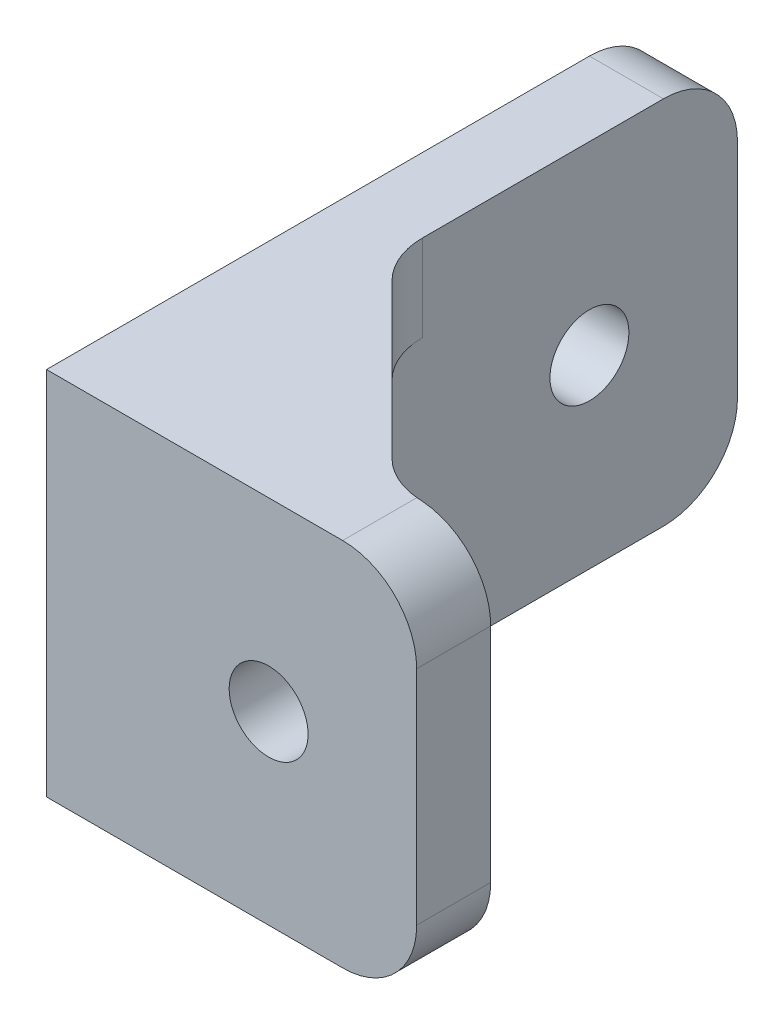
ISO-10303-21;
HEADER;
FILE_DESCRIPTION(('STEP AP214'),'2;1');
FILE_NAME('part.step','',(''),(''),'','','');
FILE_SCHEMA(('AUTOMOTIVE_DESIGN { 1 0 10303 214 1 1 1 1 }'));
ENDSEC;
DATA;
#1=APPLICATION_CONTEXT('core data for automotive mechanical design processes');
#2=APPLICATION_PROTOCOL_DEFINITION('international standard','automotive_design',2000,#1);
#3=PRODUCT_CONTEXT('',#1,'mechanical');
#4=PRODUCT('Part','Part','',(#3));
#5=PRODUCT_RELATED_PRODUCT_CATEGORY('part','',(#4));
#6=PRODUCT_DEFINITION_FORMATION('','',#4);
#7=PRODUCT_DEFINITION_CONTEXT('part definition',#1,'design');
#8=PRODUCT_DEFINITION('design','',#6,#7);
#9=PRODUCT_DEFINITION_SHAPE('','',#8);
#10=(LENGTH_UNIT() NAMED_UNIT(*) SI_UNIT(.MILLI.,.METRE.));
#11=(NAMED_UNIT(*) PLANE_ANGLE_UNIT() SI_UNIT($,.RADIAN.));
#12=(NAMED_UNIT(*) SI_UNIT($,.STERADIAN.) SOLID_ANGLE_UNIT());
#13=UNCERTAINTY_MEASURE_WITH_UNIT(LENGTH_MEASURE(1.E-05),#10,'distance_accuracy_value','');
#14=(GEOMETRIC_REPRESENTATION_CONTEXT(3) GLOBAL_UNCERTAINTY_ASSIGNED_CONTEXT((#13)) GLOBAL_UNIT_ASSIGNED_CONTEXT((#10,
#11,#12)) REPRESENTATION_CONTEXT('',''));
#15=CARTESIAN_POINT('',(0.,0.,0.));
#16=DIRECTION('',(0.,0.,1.));
#17=DIRECTION('',(1.,0.,0.));
#18=AXIS2_PLACEMENT_3D('',#15,#16,#17);
#19=CARTESIAN_POINT('',(3.,15.,-11.));
#20=DIRECTION('',(-0.707106781186551,0.,0.707106781186544));
#21=DIRECTION('',(0.,-1.,0.));
#22=AXIS2_PLACEMENT_3D('',#19,#20,#21);
#23=PLANE('',#22);
#24=DIRECTION('',(0.707106781186544,0.,0.707106781186551));
#25=VECTOR('',#24,1.);
#26=CARTESIAN_POINT('',(3.,3.5,-11.));
#27=LINE('',#26,#25);
#28=CARTESIAN_POINT('',(3.87867965644035,3.5,-10.1213203435597));
#29=VERTEX_POINT('',#28);
#30=CARTESIAN_POINT('',(10.1213203435596,3.5,-3.87867965644037));
#31=VERTEX_POINT('',#30);
#32=EDGE_CURVE('E283',#29,#31,#27,.T.);
#33=ORIENTED_EDGE('',*,*,#32,.T.);
#34=DIRECTION('',(0.,1.,0.));
#35=VECTOR('',#34,1.);
#36=CARTESIAN_POINT('',(10.1213203435596,15.,-3.87867965644037));
#37=LINE('',#36,#35);
#38=CARTESIAN_POINT('',(10.1213203435596,0.,-3.87867965644037));
#39=VERTEX_POINT('',#38);
#40=EDGE_CURVE('E319',#31,#39,#37,.F.);
#41=ORIENTED_EDGE('',*,*,#40,.T.);
#42=DIRECTION('',(0.707106781186544,0.,0.707106781186551));
#43=VECTOR('',#42,1.);
#44=CARTESIAN_POINT('',(7.00000000000004,0.,-6.99999999999997));
#45=LINE('',#44,#43);
#46=CARTESIAN_POINT('',(3.87867965644035,0.,-10.1213203435597));
#47=VERTEX_POINT('',#46);
#48=EDGE_CURVE('E271',#47,#39,#45,.T.);
#49=ORIENTED_EDGE('',*,*,#48,.F.);
#50=DIRECTION('',(0.,-1.,0.));
#51=VECTOR('',#50,1.);
#52=CARTESIAN_POINT('',(3.87867965644035,3.5,-10.1213203435597));
#53=LINE('',#52,#51);
#54=EDGE_CURVE('E316',#47,#29,#53,.F.);
#55=ORIENTED_EDGE('',*,*,#54,.T.);
#56=EDGE_LOOP('',(#33,#41,#49,#55));
#57=FACE_BOUND('',#56,.T.);
#58=ADVANCED_FACE('F45',(#57),#23,.F.);
#59=CARTESIAN_POINT('',(0.,15.,0.));
#60=DIRECTION('',(0.,0.,-1.));
#61=DIRECTION('',(-1.,0.,0.));
#62=AXIS2_PLACEMENT_3D('',#59,#60,#61);
#63=PLANE('',#62);
#64=CARTESIAN_POINT('',(9.,7.5,0.));
#65=DIRECTION('',(0.,0.,-1.));
#66=DIRECTION('',(-1.,0.,0.));
#67=AXIS2_PLACEMENT_3D('',#64,#65,#66);
#68=CIRCLE('',#67,1.6);
#69=CARTESIAN_POINT('',(7.4,7.5,0.));
#70=VERTEX_POINT('',#69);
#71=EDGE_CURVE('E212',#70,#70,#68,.T.);
#72=ORIENTED_EDGE('',*,*,#71,.T.);
#73=EDGE_LOOP('',(#72));
#74=FACE_BOUND('',#73,.T.);
#75=DIRECTION('',(1.,0.,0.));
#76=VECTOR('',#75,1.);
#77=CARTESIAN_POINT('',(0.,15.,0.));
#78=LINE('',#77,#76);
#79=CARTESIAN_POINT('',(0.,15.,0.));
#80=VERTEX_POINT('',#79);
#81=CARTESIAN_POINT('',(12.,15.,0.));
#82=VERTEX_POINT('',#81);
#83=EDGE_CURVE('E190',#80,#82,#78,.T.);
#84=ORIENTED_EDGE('',*,*,#83,.F.);
#85=DIRECTION('',(0.,-1.,0.));
#86=VECTOR('',#85,1.);
#87=CARTESIAN_POINT('',(0.,15.,0.));
#88=LINE('',#87,#86);
#89=CARTESIAN_POINT('',(0.,0.,0.));
#90=VERTEX_POINT('',#89);
#91=EDGE_CURVE('E175',#80,#90,#88,.T.);
#92=ORIENTED_EDGE('',*,*,#91,.T.);
#93=DIRECTION('',(1.,0.,0.));
#94=VECTOR('',#93,1.);
#95=CARTESIAN_POINT('',(0.,0.,0.));
#96=LINE('',#95,#94);
#97=CARTESIAN_POINT('',(12.,0.,0.));
#98=VERTEX_POINT('',#97);
#99=EDGE_CURVE('E209',#90,#98,#96,.T.);
#100=ORIENTED_EDGE('',*,*,#99,.T.);
#101=CARTESIAN_POINT('',(12.,3.,0.));
#102=DIRECTION('',(0.,0.,-1.));
#103=DIRECTION('',(-1.,0.,0.));
#104=AXIS2_PLACEMENT_3D('',#101,#102,#103);
#105=CIRCLE('',#104,3.);
#106=CARTESIAN_POINT('',(15.,3.,0.));
#107=VERTEX_POINT('',#106);
#108=EDGE_CURVE('E266',#98,#107,#105,.F.);
#109=ORIENTED_EDGE('',*,*,#108,.T.);
#110=DIRECTION('',(0.,-1.,0.));
#111=VECTOR('',#110,1.);
#112=CARTESIAN_POINT('',(15.,15.,0.));
#113=LINE('',#112,#111);
#114=CARTESIAN_POINT('',(15.,12.,0.));
#115=VERTEX_POINT('',#114);
#116=EDGE_CURVE('E223',#115,#107,#113,.T.);
#117=ORIENTED_EDGE('',*,*,#116,.F.);
#118=CARTESIAN_POINT('',(12.,12.,0.));
#119=DIRECTION('',(0.,0.,-1.));
#120=DIRECTION('',(-1.,0.,0.));
#121=AXIS2_PLACEMENT_3D('',#118,#119,#120);
#122=CIRCLE('',#121,3.);
#123=EDGE_CURVE('E199',#115,#82,#122,.F.);
#124=ORIENTED_EDGE('',*,*,#123,.T.);
#125=EDGE_LOOP('',(#84,#92,#100,#109,#117,#124));
#126=FACE_BOUND('',#125,.T.);
#127=ADVANCED_FACE('F196',(#74,#126),#63,.F.);
#128=CARTESIAN_POINT('',(15.,15.,0.));
#129=DIRECTION('',(-1.,0.,0.));
#130=DIRECTION('',(0.,0.,1.));
#131=AXIS2_PLACEMENT_3D('',#128,#129,#130);
#132=PLANE('',#131);
#133=DIRECTION('',(0.,-1.,0.));
#134=VECTOR('',#133,1.);
#135=CARTESIAN_POINT('',(15.,15.,-3.));
#136=LINE('',#135,#134);
#137=CARTESIAN_POINT('',(15.,12.,-3.));
#138=VERTEX_POINT('',#137);
#139=CARTESIAN_POINT('',(15.,3.,-3.));
#140=VERTEX_POINT('',#139);
#141=EDGE_CURVE('E220',#138,#140,#136,.T.);
#142=ORIENTED_EDGE('',*,*,#141,.F.);
#143=DIRECTION('',(0.,0.,-1.));
#144=VECTOR('',#143,1.);
#145=CARTESIAN_POINT('',(15.,12.,0.));
#146=LINE('',#145,#144);
#147=EDGE_CURVE('E263',#138,#115,#146,.F.);
#148=ORIENTED_EDGE('',*,*,#147,.T.);
#149=ORIENTED_EDGE('',*,*,#116,.T.);
#150=DIRECTION('',(0.,0.,-1.));
#151=VECTOR('',#150,1.);
#152=CARTESIAN_POINT('',(15.,3.,0.));
#153=LINE('',#152,#151);
#154=EDGE_CURVE('E259',#107,#140,#153,.T.);
#155=ORIENTED_EDGE('',*,*,#154,.T.);
#156=EDGE_LOOP('',(#142,#148,#149,#155));
#157=FACE_BOUND('',#156,.T.);
#158=ADVANCED_FACE('F384',(#157),#132,.F.);
#159=CARTESIAN_POINT('',(0.,15.,-3.));
#160=DIRECTION('',(0.,0.,-1.));
#161=DIRECTION('',(-1.,0.,0.));
#162=AXIS2_PLACEMENT_3D('',#159,#160,#161);
#163=PLANE('',#162);
#164=DIRECTION('',(1.,0.,0.));
#165=VECTOR('',#164,1.);
#166=CARTESIAN_POINT('',(-8.31370849898479,3.5,-3.));
#167=LINE('',#166,#165);
#168=CARTESIAN_POINT('',(6.,3.5,-3.));
#169=VERTEX_POINT('',#168);
#170=CARTESIAN_POINT('',(12.2426406871193,3.5,-3.));
#171=VERTEX_POINT('',#170);
#172=EDGE_CURVE('E445',#169,#171,#167,.T.);
#173=ORIENTED_EDGE('',*,*,#172,.F.);
#174=DIRECTION('',(0.,-1.,0.));
#175=VECTOR('',#174,1.);
#176=CARTESIAN_POINT('',(6.,15.,-3.));
#177=LINE('',#176,#175);
#178=CARTESIAN_POINT('',(6.,11.5,-3.));
#179=VERTEX_POINT('',#178);
#180=EDGE_CURVE('E310',#169,#179,#177,.F.);
#181=ORIENTED_EDGE('',*,*,#180,.T.);
#182=DIRECTION('',(1.,0.,0.));
#183=VECTOR('',#182,1.);
#184=CARTESIAN_POINT('',(-8.31370849898479,11.5,-3.));
#185=LINE('',#184,#183);
#186=CARTESIAN_POINT('',(12.2426406871193,11.5,-3.));
#187=VERTEX_POINT('',#186);
#188=EDGE_CURVE('E430',#179,#187,#185,.T.);
#189=ORIENTED_EDGE('',*,*,#188,.T.);
#190=DIRECTION('',(0.,1.,0.));
#191=VECTOR('',#190,1.);
#192=CARTESIAN_POINT('',(12.2426406871193,15.,-3.));
#193=LINE('',#192,#191);
#194=CARTESIAN_POINT('',(12.2426406871193,14.9901714828675,-3.));
#195=VERTEX_POINT('',#194);
#196=EDGE_CURVE('E302',#187,#195,#193,.T.);
#197=ORIENTED_EDGE('',*,*,#196,.T.);
#198=CARTESIAN_POINT('',(12.,12.,-3.));
#199=DIRECTION('',(0.,0.,-1.));
#200=DIRECTION('',(-1.,0.,0.));
#201=AXIS2_PLACEMENT_3D('',#198,#199,#200);
#202=CIRCLE('',#201,3.);
#203=EDGE_CURVE('E256',#195,#138,#202,.T.);
#204=ORIENTED_EDGE('',*,*,#203,.T.);
#205=ORIENTED_EDGE('',*,*,#141,.T.);
#206=CARTESIAN_POINT('',(12.,3.,-3.));
#207=DIRECTION('',(0.,0.,-1.));
#208=DIRECTION('',(-1.,0.,0.));
#209=AXIS2_PLACEMENT_3D('',#206,#207,#208);
#210=CIRCLE('',#209,3.);
#211=CARTESIAN_POINT('',(12.2426406871193,0.00982851713245353,-3.));
#212=VERTEX_POINT('',#211);
#213=EDGE_CURVE('E252',#140,#212,#210,.T.);
#214=ORIENTED_EDGE('',*,*,#213,.T.);
#215=DIRECTION('',(0.,1.,0.));
#216=VECTOR('',#215,1.);
#217=CARTESIAN_POINT('',(12.2426406871193,15.,-3.));
#218=LINE('',#217,#216);
#219=EDGE_CURVE('E306',#212,#171,#218,.T.);
#220=ORIENTED_EDGE('',*,*,#219,.T.);
#221=EDGE_LOOP('',(#173,#181,#189,#197,#204,#205,#214,#220));
#222=FACE_BOUND('',#221,.T.);
#223=CARTESIAN_POINT('',(9.,7.5,-3.));
#224=DIRECTION('',(0.,0.,1.));
#225=DIRECTION('',(0.,-1.,0.));
#226=AXIS2_PLACEMENT_3D('',#223,#224,#225);
#227=CIRCLE('',#226,1.6);
#228=CARTESIAN_POINT('',(9.,5.9,-3.));
#229=VERTEX_POINT('',#228);
#230=EDGE_CURVE('E448',#229,#229,#227,.F.);
#231=ORIENTED_EDGE('',*,*,#230,.F.);
#232=EDGE_LOOP('',(#231));
#233=FACE_BOUND('',#232,.T.);
#234=ADVANCED_FACE('F437',(#222,#233),#163,.T.);
#235=CARTESIAN_POINT('',(3.,15.,0.));
#236=DIRECTION('',(-1.,0.,0.));
#237=DIRECTION('',(0.,0.,1.));
#238=AXIS2_PLACEMENT_3D('',#235,#236,#237);
#239=PLANE('',#238);
#240=CARTESIAN_POINT('',(3.,7.5,-19.));
#241=DIRECTION('',(1.,0.,0.));
#242=DIRECTION('',(0.,0.,-1.));
#243=AXIS2_PLACEMENT_3D('',#240,#241,#242);
#244=CIRCLE('',#243,1.6);
#245=CARTESIAN_POINT('',(3.,7.5,-20.6));
#246=VERTEX_POINT('',#245);
#247=EDGE_CURVE('E475',#246,#246,#244,.T.);
#248=ORIENTED_EDGE('',*,*,#247,.F.);
#249=EDGE_LOOP('',(#248));
#250=FACE_BOUND('',#249,.T.);
#251=DIRECTION('',(0.,0.,1.));
#252=VECTOR('',#251,1.);
#253=CARTESIAN_POINT('',(3.,11.5,-3.));
#254=LINE('',#253,#252);
#255=CARTESIAN_POINT('',(3.,11.5,-12.2426406871193));
#256=VERTEX_POINT('',#255);
#257=CARTESIAN_POINT('',(3.,11.5,-6.));
#258=VERTEX_POINT('',#257);
#259=EDGE_CURVE('E452',#256,#258,#254,.T.);
#260=ORIENTED_EDGE('',*,*,#259,.T.);
#261=DIRECTION('',(0.,-1.,0.));
#262=VECTOR('',#261,1.);
#263=CARTESIAN_POINT('',(3.,15.,-6.));
#264=LINE('',#263,#262);
#265=CARTESIAN_POINT('',(3.,3.5,-6.));
#266=VERTEX_POINT('',#265);
#267=EDGE_CURVE('E295',#258,#266,#264,.T.);
#268=ORIENTED_EDGE('',*,*,#267,.T.);
#269=DIRECTION('',(0.,0.,-1.));
#270=VECTOR('',#269,1.);
#271=CARTESIAN_POINT('',(3.,3.5,-3.));
#272=LINE('',#271,#270);
#273=CARTESIAN_POINT('',(3.,3.5,-12.2426406871193));
#274=VERTEX_POINT('',#273);
#275=EDGE_CURVE('E460',#266,#274,#272,.T.);
#276=ORIENTED_EDGE('',*,*,#275,.T.);
#277=DIRECTION('',(0.,-1.,0.));
#278=VECTOR('',#277,1.);
#279=CARTESIAN_POINT('',(3.,0.,-12.2426406871193));
#280=LINE('',#279,#278);
#281=CARTESIAN_POINT('',(3.,0.,-12.2426406871193));
#282=VERTEX_POINT('',#281);
#283=EDGE_CURVE('E291',#274,#282,#280,.T.);
#284=ORIENTED_EDGE('',*,*,#283,.T.);
#285=DIRECTION('',(0.,0.,-1.));
#286=VECTOR('',#285,1.);
#287=CARTESIAN_POINT('',(3.,0.,0.));
#288=LINE('',#287,#286);
#289=CARTESIAN_POINT('',(3.,0.,-22.));
#290=VERTEX_POINT('',#289);
#291=EDGE_CURVE('E202',#282,#290,#288,.T.);
#292=ORIENTED_EDGE('',*,*,#291,.T.);
#293=CARTESIAN_POINT('',(3.,3.,-22.));
#294=DIRECTION('',(-1.,0.,0.));
#295=DIRECTION('',(0.,0.,1.));
#296=AXIS2_PLACEMENT_3D('',#293,#294,#295);
#297=CIRCLE('',#296,3.);
#298=CARTESIAN_POINT('',(3.,3.,-25.));
#299=VERTEX_POINT('',#298);
#300=EDGE_CURVE('E234',#290,#299,#297,.F.);
#301=ORIENTED_EDGE('',*,*,#300,.T.);
#302=DIRECTION('',(0.,-1.,0.));
#303=VECTOR('',#302,1.);
#304=CARTESIAN_POINT('',(3.,15.,-25.));
#305=LINE('',#304,#303);
#306=CARTESIAN_POINT('',(3.,12.,-25.));
#307=VERTEX_POINT('',#306);
#308=EDGE_CURVE('E206',#307,#299,#305,.T.);
#309=ORIENTED_EDGE('',*,*,#308,.F.);
#310=CARTESIAN_POINT('',(3.,12.,-22.));
#311=DIRECTION('',(-1.,0.,0.));
#312=DIRECTION('',(0.,0.,1.));
#313=AXIS2_PLACEMENT_3D('',#310,#311,#312);
#314=CIRCLE('',#313,3.);
#315=CARTESIAN_POINT('',(3.,15.,-22.));
#316=VERTEX_POINT('',#315);
#317=EDGE_CURVE('E237',#307,#316,#314,.F.);
#318=ORIENTED_EDGE('',*,*,#317,.T.);
#319=DIRECTION('',(0.,0.,-1.));
#320=VECTOR('',#319,1.);
#321=CARTESIAN_POINT('',(3.,15.,0.));
#322=LINE('',#321,#320);
#323=CARTESIAN_POINT('',(3.,15.,-12.2426406871193));
#324=VERTEX_POINT('',#323);
#325=EDGE_CURVE('E201',#324,#316,#322,.T.);
#326=ORIENTED_EDGE('',*,*,#325,.F.);
#327=DIRECTION('',(0.,-1.,0.));
#328=VECTOR('',#327,1.);
#329=CARTESIAN_POINT('',(3.,11.5,-12.2426406871193));
#330=LINE('',#329,#328);
#331=EDGE_CURVE('E287',#324,#256,#330,.T.);
#332=ORIENTED_EDGE('',*,*,#331,.T.);
#333=EDGE_LOOP('',(#260,#268,#276,#284,#292,#301,#309,#318,#326,#332));
#334=FACE_BOUND('',#333,.T.);
#335=CARTESIAN_POINT('',(3.,7.5,-9.));
#336=DIRECTION('',(-1.,0.,0.));
#337=DIRECTION('',(0.,0.,1.));
#338=AXIS2_PLACEMENT_3D('',#335,#336,#337);
#339=CIRCLE('',#338,1.6);
#340=CARTESIAN_POINT('',(3.,7.5,-7.4));
#341=VERTEX_POINT('',#340);
#342=EDGE_CURVE('E472',#341,#341,#339,.F.);
#343=ORIENTED_EDGE('',*,*,#342,.F.);
#344=EDGE_LOOP('',(#343));
#345=FACE_BOUND('',#344,.T.);
#346=ADVANCED_FACE('F455',(#250,#334,#345),#239,.F.);
#347=CARTESIAN_POINT('',(0.,15.,-25.));
#348=DIRECTION('',(0.,0.,-1.));
#349=DIRECTION('',(-1.,0.,0.));
#350=AXIS2_PLACEMENT_3D('',#347,#348,#349);
#351=PLANE('',#350);
#352=DIRECTION('',(0.,-1.,0.));
#353=VECTOR('',#352,1.);
#354=CARTESIAN_POINT('',(0.,15.,-25.));
#355=LINE('',#354,#353);
#356=CARTESIAN_POINT('',(0.,12.,-25.));
#357=VERTEX_POINT('',#356);
#358=CARTESIAN_POINT('',(0.,3.,-25.));
#359=VERTEX_POINT('',#358);
#360=EDGE_CURVE('E61',#357,#359,#355,.T.);
#361=ORIENTED_EDGE('',*,*,#360,.F.);
#362=DIRECTION('',(1.,0.,0.));
#363=VECTOR('',#362,1.);
#364=CARTESIAN_POINT('',(0.,12.,-25.));
#365=LINE('',#364,#363);
#366=EDGE_CURVE('E231',#357,#307,#365,.T.);
#367=ORIENTED_EDGE('',*,*,#366,.T.);
#368=ORIENTED_EDGE('',*,*,#308,.T.);
#369=DIRECTION('',(1.,0.,0.));
#370=VECTOR('',#369,1.);
#371=CARTESIAN_POINT('',(0.,3.,-25.));
#372=LINE('',#371,#370);
#373=EDGE_CURVE('E227',#299,#359,#372,.F.);
#374=ORIENTED_EDGE('',*,*,#373,.T.);
#375=EDGE_LOOP('',(#361,#367,#368,#374));
#376=FACE_BOUND('',#375,.T.);
#377=ADVANCED_FACE('F500',(#376),#351,.T.);
#378=CARTESIAN_POINT('',(0.,15.,0.));
#379=DIRECTION('',(0.,1.,0.));
#380=DIRECTION('',(0.,0.,1.));
#381=AXIS2_PLACEMENT_3D('',#378,#379,#380);
#382=PLANE('',#381);
#383=DIRECTION('',(0.,0.,1.));
#384=VECTOR('',#383,1.);
#385=CARTESIAN_POINT('',(0.,15.,0.));
#386=LINE('',#385,#384);
#387=CARTESIAN_POINT('',(0.,15.,-22.));
#388=VERTEX_POINT('',#387);
#389=EDGE_CURVE('E179',#388,#80,#386,.T.);
#390=ORIENTED_EDGE('',*,*,#389,.T.);
#391=ORIENTED_EDGE('',*,*,#83,.T.);
#392=DIRECTION('',(0.,0.,-1.));
#393=VECTOR('',#392,1.);
#394=CARTESIAN_POINT('',(12.,15.,-3.));
#395=LINE('',#394,#393);
#396=CARTESIAN_POINT('',(12.,15.,-3.00982851713245));
#397=VERTEX_POINT('',#396);
#398=EDGE_CURVE('E69',#82,#397,#395,.T.);
#399=ORIENTED_EDGE('',*,*,#398,.T.);
#400=CARTESIAN_POINT('',(12.2426406871193,15.,-6.));
#401=DIRECTION('',(0.,1.,0.));
#402=DIRECTION('',(0.,0.,1.));
#403=AXIS2_PLACEMENT_3D('',#400,#401,#402);
#404=CIRCLE('',#403,3.);
#405=CARTESIAN_POINT('',(10.1213203435596,15.,-3.87867965644037));
#406=VERTEX_POINT('',#405);
#407=EDGE_CURVE('E422',#397,#406,#404,.F.);
#408=ORIENTED_EDGE('',*,*,#407,.T.);
#409=DIRECTION('',(-0.707106781186544,0.,-0.707106781186551));
#410=VECTOR('',#409,1.);
#411=CARTESIAN_POINT('',(3.,15.,-11.));
#412=LINE('',#411,#410);
#413=CARTESIAN_POINT('',(3.87867965644035,15.,-10.1213203435597));
#414=VERTEX_POINT('',#413);
#415=EDGE_CURVE('E275',#406,#414,#412,.T.);
#416=ORIENTED_EDGE('',*,*,#415,.T.);
#417=CARTESIAN_POINT('',(6.,15.,-12.2426406871193));
#418=DIRECTION('',(0.,1.,0.));
#419=DIRECTION('',(0.,0.,1.));
#420=AXIS2_PLACEMENT_3D('',#417,#418,#419);
#421=CIRCLE('',#420,3.);
#422=EDGE_CURVE('E410',#414,#324,#421,.F.);
#423=ORIENTED_EDGE('',*,*,#422,.T.);
#424=ORIENTED_EDGE('',*,*,#325,.T.);
#425=DIRECTION('',(1.,0.,0.));
#426=VECTOR('',#425,1.);
#427=CARTESIAN_POINT('',(0.,15.,-22.));
#428=LINE('',#427,#426);
#429=EDGE_CURVE('E193',#316,#388,#428,.F.);
#430=ORIENTED_EDGE('',*,*,#429,.T.);
#431=EDGE_LOOP('',(#390,#391,#399,#408,#416,#423,#424,#430));
#432=FACE_BOUND('',#431,.T.);
#433=ADVANCED_FACE('F189',(#432),#382,.T.);
#434=CARTESIAN_POINT('',(0.,0.,0.));
#435=DIRECTION('',(0.,1.,0.));
#436=DIRECTION('',(0.,0.,1.));
#437=AXIS2_PLACEMENT_3D('',#434,#435,#436);
#438=PLANE('',#437);
#439=ORIENTED_EDGE('',*,*,#99,.F.);
#440=DIRECTION('',(0.,0.,1.));
#441=VECTOR('',#440,1.);
#442=CARTESIAN_POINT('',(0.,0.,0.));
#443=LINE('',#442,#441);
#444=CARTESIAN_POINT('',(0.,0.,-22.));
#445=VERTEX_POINT('',#444);
#446=EDGE_CURVE('E182',#445,#90,#443,.T.);
#447=ORIENTED_EDGE('',*,*,#446,.F.);
#448=DIRECTION('',(1.,0.,0.));
#449=VECTOR('',#448,1.);
#450=CARTESIAN_POINT('',(3.,0.,-22.));
#451=LINE('',#450,#449);
#452=EDGE_CURVE('E249',#445,#290,#451,.T.);
#453=ORIENTED_EDGE('',*,*,#452,.T.);
#454=ORIENTED_EDGE('',*,*,#291,.F.);
#455=CARTESIAN_POINT('',(6.,0.,-12.2426406871193));
#456=DIRECTION('',(0.,1.,0.));
#457=DIRECTION('',(0.,0.,1.));
#458=AXIS2_PLACEMENT_3D('',#455,#456,#457);
#459=CIRCLE('',#458,3.);
#460=EDGE_CURVE('E344',#282,#47,#459,.T.);
#461=ORIENTED_EDGE('',*,*,#460,.T.);
#462=ORIENTED_EDGE('',*,*,#48,.T.);
#463=CARTESIAN_POINT('',(12.2426406871193,0.,-6.));
#464=DIRECTION('',(0.,1.,0.));
#465=DIRECTION('',(0.,0.,1.));
#466=AXIS2_PLACEMENT_3D('',#463,#464,#465);
#467=CIRCLE('',#466,3.);
#468=CARTESIAN_POINT('',(12.,0.,-3.00982851713245));
#469=VERTEX_POINT('',#468);
#470=EDGE_CURVE('E331',#39,#469,#467,.T.);
#471=ORIENTED_EDGE('',*,*,#470,.T.);
#472=DIRECTION('',(0.,0.,-1.));
#473=VECTOR('',#472,1.);
#474=CARTESIAN_POINT('',(12.,0.,0.));
#475=LINE('',#474,#473);
#476=EDGE_CURVE('E245',#469,#98,#475,.F.);
#477=ORIENTED_EDGE('',*,*,#476,.T.);
#478=EDGE_LOOP('',(#439,#447,#453,#454,#461,#462,#471,#477));
#479=FACE_BOUND('',#478,.T.);
#480=ADVANCED_FACE('F399',(#479),#438,.F.);
#481=CARTESIAN_POINT('',(9.,7.5,0.));
#482=DIRECTION('',(0.,0.,-1.));
#483=DIRECTION('',(-1.,0.,0.));
#484=AXIS2_PLACEMENT_3D('',#481,#482,#483);
#485=CYLINDRICAL_SURFACE('',#484,1.6);
#486=ORIENTED_EDGE('',*,*,#230,.T.);
#487=EDGE_LOOP('',(#486));
#488=FACE_BOUND('',#487,.T.);
#489=ORIENTED_EDGE('',*,*,#71,.F.);
#490=EDGE_LOOP('',(#489));
#491=FACE_BOUND('',#490,.T.);
#492=ADVANCED_FACE('F484',(#488,#491),#485,.F.);
#493=CARTESIAN_POINT('',(0.,7.5,-19.));
#494=DIRECTION('',(1.,0.,0.));
#495=DIRECTION('',(0.,0.,-1.));
#496=AXIS2_PLACEMENT_3D('',#493,#494,#495);
#497=CYLINDRICAL_SURFACE('',#496,1.6);
#498=CARTESIAN_POINT('',(0.,7.5,-19.));
#499=DIRECTION('',(1.,0.,0.));
#500=DIRECTION('',(0.,0.,-1.));
#501=AXIS2_PLACEMENT_3D('',#498,#499,#500);
#502=CIRCLE('',#501,1.6);
#503=CARTESIAN_POINT('',(0.,7.5,-20.6));
#504=VERTEX_POINT('',#503);
#505=EDGE_CURVE('E465',#504,#504,#502,.F.);
#506=ORIENTED_EDGE('',*,*,#505,.T.);
#507=EDGE_LOOP('',(#506));
#508=FACE_BOUND('',#507,.T.);
#509=ORIENTED_EDGE('',*,*,#247,.T.);
#510=EDGE_LOOP('',(#509));
#511=FACE_BOUND('',#510,.T.);
#512=ADVANCED_FACE('F486',(#508,#511),#497,.F.);
#513=CARTESIAN_POINT('',(0.,7.5,-9.));
#514=DIRECTION('',(1.,0.,0.));
#515=DIRECTION('',(0.,0.,-1.));
#516=AXIS2_PLACEMENT_3D('',#513,#514,#515);
#517=CYLINDRICAL_SURFACE('',#516,1.6);
#518=CARTESIAN_POINT('',(0.,7.5,-9.));
#519=DIRECTION('',(1.,0.,0.));
#520=DIRECTION('',(0.,0.,-1.));
#521=AXIS2_PLACEMENT_3D('',#518,#519,#520);
#522=CIRCLE('',#521,1.6);
#523=CARTESIAN_POINT('',(0.,7.5,-10.6));
#524=VERTEX_POINT('',#523);
#525=EDGE_CURVE('E535',#524,#524,#522,.F.);
#526=ORIENTED_EDGE('',*,*,#525,.T.);
#527=EDGE_LOOP('',(#526));
#528=FACE_BOUND('',#527,.T.);
#529=ORIENTED_EDGE('',*,*,#342,.T.);
#530=EDGE_LOOP('',(#529));
#531=FACE_BOUND('',#530,.T.);
#532=ADVANCED_FACE('F493',(#528,#531),#517,.F.);
#533=CARTESIAN_POINT('',(0.,12.,-22.));
#534=DIRECTION('',(1.,0.,0.));
#535=DIRECTION('',(0.,0.,-1.));
#536=AXIS2_PLACEMENT_3D('',#533,#534,#535);
#537=CYLINDRICAL_SURFACE('',#536,3.);
#538=CARTESIAN_POINT('',(0.,12.,-22.));
#539=DIRECTION('',(1.,0.,0.));
#540=DIRECTION('',(0.,0.,-1.));
#541=AXIS2_PLACEMENT_3D('',#538,#539,#540);
#542=CIRCLE('',#541,3.);
#543=EDGE_CURVE('E531',#388,#357,#542,.F.);
#544=ORIENTED_EDGE('',*,*,#543,.F.);
#545=ORIENTED_EDGE('',*,*,#429,.F.);
#546=ORIENTED_EDGE('',*,*,#317,.F.);
#547=ORIENTED_EDGE('',*,*,#366,.F.);
#548=EDGE_LOOP('',(#544,#545,#546,#547));
#549=FACE_BOUND('',#548,.T.);
#550=ADVANCED_FACE('F512',(#549),#537,.T.);
#551=CARTESIAN_POINT('',(0.,3.,-22.));
#552=DIRECTION('',(-1.,0.,0.));
#553=DIRECTION('',(0.,0.,1.));
#554=AXIS2_PLACEMENT_3D('',#551,#552,#553);
#555=CYLINDRICAL_SURFACE('',#554,3.);
#556=CARTESIAN_POINT('',(0.,3.,-22.));
#557=DIRECTION('',(1.,0.,0.));
#558=DIRECTION('',(0.,0.,-1.));
#559=AXIS2_PLACEMENT_3D('',#556,#557,#558);
#560=CIRCLE('',#559,3.);
#561=EDGE_CURVE('E11',#359,#445,#560,.F.);
#562=ORIENTED_EDGE('',*,*,#561,.F.);
#563=ORIENTED_EDGE('',*,*,#373,.F.);
#564=ORIENTED_EDGE('',*,*,#300,.F.);
#565=ORIENTED_EDGE('',*,*,#452,.F.);
#566=EDGE_LOOP('',(#562,#563,#564,#565));
#567=FACE_BOUND('',#566,.T.);
#568=ADVANCED_FACE('F514',(#567),#555,.T.);
#569=CARTESIAN_POINT('',(12.,12.,0.));
#570=DIRECTION('',(0.,0.,1.));
#571=DIRECTION('',(1.,0.,0.));
#572=AXIS2_PLACEMENT_3D('',#569,#570,#571);
#573=CYLINDRICAL_SURFACE('',#572,3.);
#574=ORIENTED_EDGE('',*,*,#123,.F.);
#575=ORIENTED_EDGE('',*,*,#147,.F.);
#576=ORIENTED_EDGE('',*,*,#203,.F.);
#577=CARTESIAN_POINT('',(12.2426406871193,14.9901714828675,-3.));
#578=CARTESIAN_POINT('',(12.2022005725994,14.9934496693885,-2.99999798585657));
#579=CARTESIAN_POINT('',(12.1617604580795,14.9959078057433,-3.00081602187923));
#580=CARTESIAN_POINT('',(12.0808802290398,14.9991839781208,-3.00409219425671));
#581=CARTESIAN_POINT('',(12.0404401145199,15.0000020141434,-3.00655033061154));
#582=CARTESIAN_POINT('',(12.,15.,-3.00982851713245));
#583=B_SPLINE_CURVE_WITH_KNOTS('',3,(#577,#578,#579,#580,#581,#582),.UNSPECIFIED.,.F.,.F.,(4,2,
4),(0.,0.121569035189417,0.243138070378835),.UNSPECIFIED.);
#584=EDGE_CURVE('E415',#195,#397,#583,.T.);
#585=ORIENTED_EDGE('',*,*,#584,.T.);
#586=ORIENTED_EDGE('',*,*,#398,.F.);
#587=EDGE_LOOP('',(#574,#575,#576,#585,#586));
#588=FACE_BOUND('',#587,.T.);
#589=ADVANCED_FACE('F356',(#588),#573,.T.);
#590=CARTESIAN_POINT('',(12.,3.,0.));
#591=DIRECTION('',(0.,0.,-1.));
#592=DIRECTION('',(-1.,0.,0.));
#593=AXIS2_PLACEMENT_3D('',#590,#591,#592);
#594=CYLINDRICAL_SURFACE('',#593,3.);
#595=ORIENTED_EDGE('',*,*,#108,.F.);
#596=ORIENTED_EDGE('',*,*,#476,.F.);
#597=CARTESIAN_POINT('',(12.,0.,-3.00982851713245));
#598=CARTESIAN_POINT('',(12.0404401145199,-2.01414342796575E-06,-3.00655033061154));
#599=CARTESIAN_POINT('',(12.0808802290398,0.000816021879229198,-3.00409219425671));
#600=CARTESIAN_POINT('',(12.1617604580795,0.00409219425671379,-3.00081602187923));
#601=CARTESIAN_POINT('',(12.2022005725994,0.00655033061154121,-2.99999798585657));
#602=CARTESIAN_POINT('',(12.2426406871193,0.00982851713245376,-3.));
#603=B_SPLINE_CURVE_WITH_KNOTS('',3,(#597,#598,#599,#600,#601,#602),.UNSPECIFIED.,.F.,.F.,(4,2,
4),(0.,0.121569035189417,0.243138070378835),.UNSPECIFIED.);
#604=EDGE_CURVE('E335',#469,#212,#603,.T.);
#605=ORIENTED_EDGE('',*,*,#604,.T.);
#606=ORIENTED_EDGE('',*,*,#213,.F.);
#607=ORIENTED_EDGE('',*,*,#154,.F.);
#608=EDGE_LOOP('',(#595,#596,#605,#606,#607));
#609=FACE_BOUND('',#608,.T.);
#610=ADVANCED_FACE('F350',(#609),#594,.T.);
#611=DIRECTION('',(-0.707106781186544,0.,-0.707106781186551));
#612=VECTOR('',#611,1.);
#613=CARTESIAN_POINT('',(3.,11.5,-11.));
#614=LINE('',#613,#612);
#615=CARTESIAN_POINT('',(10.1213203435596,11.5,-3.87867965644037));
#616=VERTEX_POINT('',#615);
#617=CARTESIAN_POINT('',(3.87867965644035,11.5,-10.1213203435597));
#618=VERTEX_POINT('',#617);
#619=EDGE_CURVE('E279',#616,#618,#614,.T.);
#620=ORIENTED_EDGE('',*,*,#619,.T.);
#621=DIRECTION('',(0.,-1.,0.));
#622=VECTOR('',#621,1.);
#623=CARTESIAN_POINT('',(3.87867965644035,15.,-10.1213203435597));
#624=LINE('',#623,#622);
#625=EDGE_CURVE('E325',#618,#414,#624,.F.);
#626=ORIENTED_EDGE('',*,*,#625,.T.);
#627=ORIENTED_EDGE('',*,*,#415,.F.);
#628=DIRECTION('',(0.,1.,0.));
#629=VECTOR('',#628,1.);
#630=CARTESIAN_POINT('',(10.1213203435596,15.,-3.87867965644037));
#631=LINE('',#630,#629);
#632=EDGE_CURVE('E322',#406,#616,#631,.F.);
#633=ORIENTED_EDGE('',*,*,#632,.T.);
#634=EDGE_LOOP('',(#620,#626,#627,#633));
#635=FACE_BOUND('',#634,.T.);
#636=ADVANCED_FACE('F355',(#635),#23,.F.);
#637=CARTESIAN_POINT('',(-8.31370849898479,3.5,-3.));
#638=DIRECTION('',(0.,-1.,0.));
#639=DIRECTION('',(0.,0.,-1.));
#640=AXIS2_PLACEMENT_3D('',#637,#638,#639);
#641=PLANE('',#640);
#642=ORIENTED_EDGE('',*,*,#275,.F.);
#643=CARTESIAN_POINT('',(6.,3.5,-6.));
#644=DIRECTION('',(0.,-1.,0.));
#645=DIRECTION('',(0.,0.,-1.));
#646=AXIS2_PLACEMENT_3D('',#643,#644,#645);
#647=CIRCLE('',#646,3.);
#648=EDGE_CURVE('E299',#266,#169,#647,.F.);
#649=ORIENTED_EDGE('',*,*,#648,.T.);
#650=ORIENTED_EDGE('',*,*,#172,.T.);
#651=CARTESIAN_POINT('',(12.2426406871193,3.5,-6.));
#652=DIRECTION('',(0.,-1.,0.));
#653=DIRECTION('',(0.,0.,-1.));
#654=AXIS2_PLACEMENT_3D('',#651,#652,#653);
#655=CIRCLE('',#654,3.);
#656=EDGE_CURVE('E328',#171,#31,#655,.T.);
#657=ORIENTED_EDGE('',*,*,#656,.T.);
#658=ORIENTED_EDGE('',*,*,#32,.F.);
#659=CARTESIAN_POINT('',(6.,3.5,-12.2426406871193));
#660=DIRECTION('',(0.,-1.,0.));
#661=DIRECTION('',(0.,0.,-1.));
#662=AXIS2_PLACEMENT_3D('',#659,#660,#661);
#663=CIRCLE('',#662,3.);
#664=EDGE_CURVE('E404',#29,#274,#663,.T.);
#665=ORIENTED_EDGE('',*,*,#664,.T.);
#666=EDGE_LOOP('',(#642,#649,#650,#657,#658,#665));
#667=FACE_BOUND('',#666,.T.);
#668=ADVANCED_FACE('F364',(#667),#641,.F.);
#669=CARTESIAN_POINT('',(-8.31370849898479,11.5,-3.));
#670=DIRECTION('',(0.,1.,0.));
#671=DIRECTION('',(0.,0.,1.));
#672=AXIS2_PLACEMENT_3D('',#669,#670,#671);
#673=PLANE('',#672);
#674=ORIENTED_EDGE('',*,*,#188,.F.);
#675=CARTESIAN_POINT('',(6.,11.5,-6.));
#676=DIRECTION('',(0.,1.,0.));
#677=DIRECTION('',(0.,0.,1.));
#678=AXIS2_PLACEMENT_3D('',#675,#676,#677);
#679=CIRCLE('',#678,3.);
#680=EDGE_CURVE('E313',#179,#258,#679,.F.);
#681=ORIENTED_EDGE('',*,*,#680,.T.);
#682=ORIENTED_EDGE('',*,*,#259,.F.);
#683=CARTESIAN_POINT('',(6.,11.5,-12.2426406871193));
#684=DIRECTION('',(0.,1.,0.));
#685=DIRECTION('',(0.,0.,1.));
#686=AXIS2_PLACEMENT_3D('',#683,#684,#685);
#687=CIRCLE('',#686,3.);
#688=EDGE_CURVE('E407',#256,#618,#687,.T.);
#689=ORIENTED_EDGE('',*,*,#688,.T.);
#690=ORIENTED_EDGE('',*,*,#619,.F.);
#691=CARTESIAN_POINT('',(12.2426406871193,11.5,-6.));
#692=DIRECTION('',(0.,1.,0.));
#693=DIRECTION('',(0.,0.,1.));
#694=AXIS2_PLACEMENT_3D('',#691,#692,#693);
#695=CIRCLE('',#694,3.);
#696=EDGE_CURVE('E55',#616,#187,#695,.T.);
#697=ORIENTED_EDGE('',*,*,#696,.T.);
#698=EDGE_LOOP('',(#674,#681,#682,#689,#690,#697));
#699=FACE_BOUND('',#698,.T.);
#700=ADVANCED_FACE('F368',(#699),#673,.F.);
#701=CARTESIAN_POINT('',(6.,15.,-6.));
#702=DIRECTION('',(0.,-1.,0.));
#703=DIRECTION('',(0.,0.,-1.));
#704=AXIS2_PLACEMENT_3D('',#701,#702,#703);
#705=CYLINDRICAL_SURFACE('',#704,3.);
#706=ORIENTED_EDGE('',*,*,#680,.F.);
#707=ORIENTED_EDGE('',*,*,#180,.F.);
#708=ORIENTED_EDGE('',*,*,#648,.F.);
#709=ORIENTED_EDGE('',*,*,#267,.F.);
#710=EDGE_LOOP('',(#706,#707,#708,#709));
#711=FACE_BOUND('',#710,.T.);
#712=ADVANCED_FACE('F366',(#711),#705,.F.);
#713=CARTESIAN_POINT('',(12.2426406871193,15.,-6.));
#714=DIRECTION('',(0.,1.,0.));
#715=DIRECTION('',(0.,0.,1.));
#716=AXIS2_PLACEMENT_3D('',#713,#714,#715);
#717=CYLINDRICAL_SURFACE('',#716,3.);
#718=ORIENTED_EDGE('',*,*,#470,.F.);
#719=ORIENTED_EDGE('',*,*,#40,.F.);
#720=ORIENTED_EDGE('',*,*,#656,.F.);
#721=ORIENTED_EDGE('',*,*,#219,.F.);
#722=ORIENTED_EDGE('',*,*,#604,.F.);
#723=EDGE_LOOP('',(#718,#719,#720,#721,#722));
#724=FACE_BOUND('',#723,.T.);
#725=ADVANCED_FACE('F346',(#724),#717,.F.);
#726=CARTESIAN_POINT('',(6.,15.,-12.2426406871193));
#727=DIRECTION('',(0.,1.,0.));
#728=DIRECTION('',(0.,0.,1.));
#729=AXIS2_PLACEMENT_3D('',#726,#727,#728);
#730=CYLINDRICAL_SURFACE('',#729,3.);
#731=ORIENTED_EDGE('',*,*,#664,.F.);
#732=ORIENTED_EDGE('',*,*,#54,.F.);
#733=ORIENTED_EDGE('',*,*,#460,.F.);
#734=ORIENTED_EDGE('',*,*,#283,.F.);
#735=EDGE_LOOP('',(#731,#732,#733,#734));
#736=FACE_BOUND('',#735,.T.);
#737=ADVANCED_FACE('F374',(#736),#730,.F.);
#738=CARTESIAN_POINT('',(6.,15.,-12.2426406871193));
#739=DIRECTION('',(0.,1.,0.));
#740=DIRECTION('',(0.,0.,1.));
#741=AXIS2_PLACEMENT_3D('',#738,#739,#740);
#742=CYLINDRICAL_SURFACE('',#741,3.);
#743=ORIENTED_EDGE('',*,*,#422,.F.);
#744=ORIENTED_EDGE('',*,*,#625,.F.);
#745=ORIENTED_EDGE('',*,*,#688,.F.);
#746=ORIENTED_EDGE('',*,*,#331,.F.);
#747=EDGE_LOOP('',(#743,#744,#745,#746));
#748=FACE_BOUND('',#747,.T.);
#749=ADVANCED_FACE('F547',(#748),#742,.F.);
#750=CARTESIAN_POINT('',(12.2426406871193,15.,-6.));
#751=DIRECTION('',(0.,1.,0.));
#752=DIRECTION('',(0.,0.,1.));
#753=AXIS2_PLACEMENT_3D('',#750,#751,#752);
#754=CYLINDRICAL_SURFACE('',#753,3.);
#755=ORIENTED_EDGE('',*,*,#696,.F.);
#756=ORIENTED_EDGE('',*,*,#632,.F.);
#757=ORIENTED_EDGE('',*,*,#407,.F.);
#758=ORIENTED_EDGE('',*,*,#584,.F.);
#759=ORIENTED_EDGE('',*,*,#196,.F.);
#760=EDGE_LOOP('',(#755,#756,#757,#758,#759));
#761=FACE_BOUND('',#760,.T.);
#762=ADVANCED_FACE('F47',(#761),#754,.F.);
#763=CARTESIAN_POINT('',(0.,15.,0.));
#764=DIRECTION('',(1.,0.,0.));
#765=DIRECTION('',(0.,0.,-1.));
#766=AXIS2_PLACEMENT_3D('',#763,#764,#765);
#767=PLANE('',#766);
#768=ORIENTED_EDGE('',*,*,#525,.F.);
#769=EDGE_LOOP('',(#768));
#770=FACE_BOUND('',#769,.T.);
#771=ORIENTED_EDGE('',*,*,#543,.T.);
#772=ORIENTED_EDGE('',*,*,#360,.T.);
#773=ORIENTED_EDGE('',*,*,#561,.T.);
#774=ORIENTED_EDGE('',*,*,#446,.T.);
#775=ORIENTED_EDGE('',*,*,#91,.F.);
#776=ORIENTED_EDGE('',*,*,#389,.F.);
#777=EDGE_LOOP('',(#771,#772,#773,#774,#775,#776));
#778=FACE_BOUND('',#777,.T.);
#779=ORIENTED_EDGE('',*,*,#505,.F.);
#780=EDGE_LOOP('',(#779));
#781=FACE_BOUND('',#780,.T.);
#782=ADVANCED_FACE('F177',(#770,#778,#781),#767,.F.);
#783=CLOSED_SHELL('',(#58,#127,#158,#234,#346,#377,#433,#480,#492,#512,#532,#550,#568,#589,#610,
#636,#668,#700,#712,#725,#737,#749,#762,#782));
#784=MANIFOLD_SOLID_BREP('B2',#783);
#785=ADVANCED_BREP_SHAPE_REPRESENTATION('',(#18,#784),#14);
#786=SHAPE_DEFINITION_REPRESENTATION(#9,#785);
ENDSEC;
END-ISO-10303-21;
